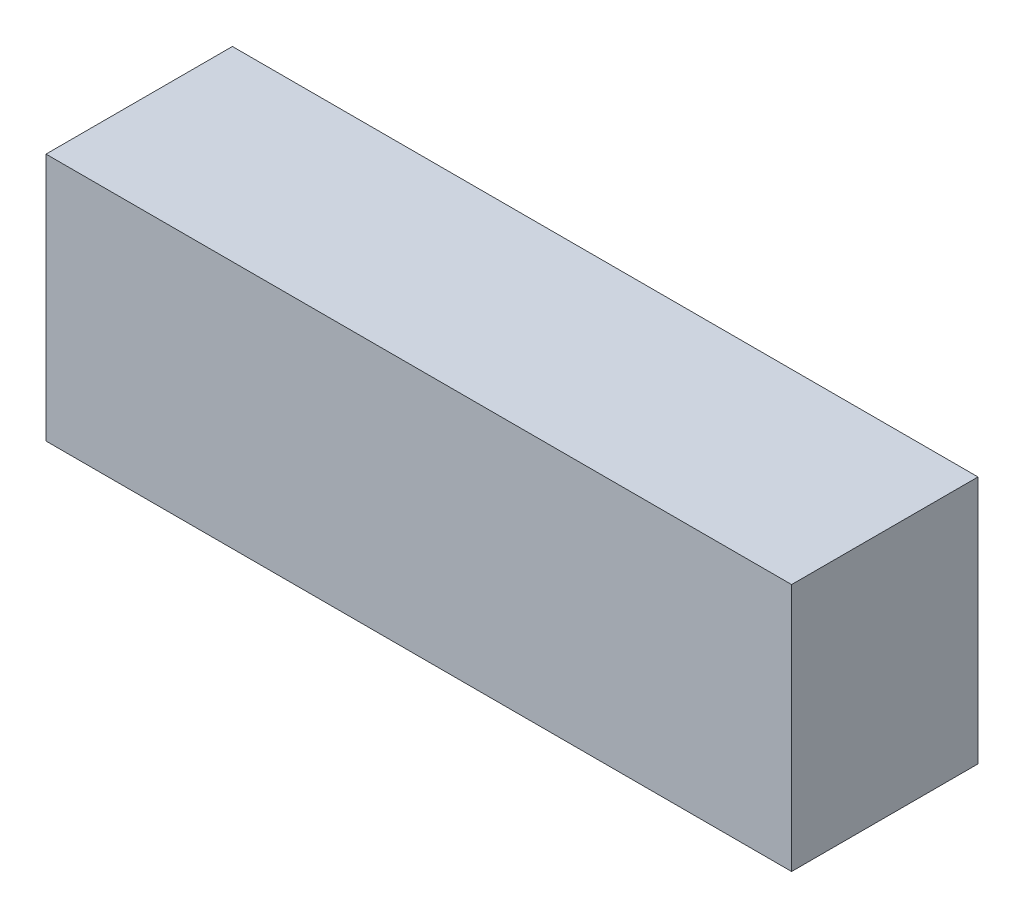
ISO-10303-21;
HEADER;
FILE_DESCRIPTION(('STEP AP214'),'2;1');
FILE_NAME('part.step','',(''),(''),'','','');
FILE_SCHEMA(('AUTOMOTIVE_DESIGN { 1 0 10303 214 1 1 1 1 }'));
ENDSEC;
DATA;
#1=APPLICATION_CONTEXT('core data for automotive mechanical design processes');
#2=APPLICATION_PROTOCOL_DEFINITION('international standard','automotive_design',2000,#1);
#3=PRODUCT_CONTEXT('',#1,'mechanical');
#4=PRODUCT('Part','Part','',(#3));
#5=PRODUCT_RELATED_PRODUCT_CATEGORY('part','',(#4));
#6=PRODUCT_DEFINITION_FORMATION('','',#4);
#7=PRODUCT_DEFINITION_CONTEXT('part definition',#1,'design');
#8=PRODUCT_DEFINITION('design','',#6,#7);
#9=PRODUCT_DEFINITION_SHAPE('','',#8);
#10=(LENGTH_UNIT() NAMED_UNIT(*) SI_UNIT(.MILLI.,.METRE.));
#11=(NAMED_UNIT(*) PLANE_ANGLE_UNIT() SI_UNIT($,.RADIAN.));
#12=(NAMED_UNIT(*) SI_UNIT($,.STERADIAN.) SOLID_ANGLE_UNIT());
#13=UNCERTAINTY_MEASURE_WITH_UNIT(LENGTH_MEASURE(1.E-05),#10,'distance_accuracy_value','');
#14=(GEOMETRIC_REPRESENTATION_CONTEXT(3) GLOBAL_UNCERTAINTY_ASSIGNED_CONTEXT((#13)) GLOBAL_UNIT_ASSIGNED_CONTEXT((#10,
#11,#12)) REPRESENTATION_CONTEXT('',''));
#15=CARTESIAN_POINT('',(0.,0.,0.));
#16=DIRECTION('',(0.,0.,1.));
#17=DIRECTION('',(1.,0.,0.));
#18=AXIS2_PLACEMENT_3D('',#15,#16,#17);
#19=CARTESIAN_POINT('',(275.,-45.,37.8606367334853));
#20=DIRECTION('',(-1.,0.,0.));
#21=DIRECTION('',(0.,0.,1.));
#22=AXIS2_PLACEMENT_3D('',#19,#20,#21);
#23=PLANE('',#22);
#24=DIRECTION('',(0.,1.,0.));
#25=VECTOR('',#24,1.);
#26=CARTESIAN_POINT('',(275.,-45.,7.86063673348532));
#27=LINE('',#26,#25);
#28=CARTESIAN_POINT('',(275.,-45.,7.86063673348532));
#29=VERTEX_POINT('',#28);
#30=CARTESIAN_POINT('',(275.,-5.00000000000002,7.86063673348532));
#31=VERTEX_POINT('',#30);
#32=EDGE_CURVE('E103',#29,#31,#27,.T.);
#33=ORIENTED_EDGE('',*,*,#32,.T.);
#34=DIRECTION('',(0.,0.,-1.));
#35=VECTOR('',#34,1.);
#36=CARTESIAN_POINT('',(275.,-5.00000000000002,37.8606367334853));
#37=LINE('',#36,#35);
#38=CARTESIAN_POINT('',(275.,-5.00000000000002,37.8606367334853));
#39=VERTEX_POINT('',#38);
#40=EDGE_CURVE('E11',#39,#31,#37,.T.);
#41=ORIENTED_EDGE('',*,*,#40,.F.);
#42=DIRECTION('',(0.,1.,0.));
#43=VECTOR('',#42,1.);
#44=CARTESIAN_POINT('',(275.,-45.,37.8606367334853));
#45=LINE('',#44,#43);
#46=CARTESIAN_POINT('',(275.,-45.,37.8606367334853));
#47=VERTEX_POINT('',#46);
#48=EDGE_CURVE('E91',#47,#39,#45,.T.);
#49=ORIENTED_EDGE('',*,*,#48,.F.);
#50=DIRECTION('',(0.,0.,-1.));
#51=VECTOR('',#50,1.);
#52=CARTESIAN_POINT('',(275.,-45.,37.8606367334853));
#53=LINE('',#52,#51);
#54=EDGE_CURVE('E99',#47,#29,#53,.T.);
#55=ORIENTED_EDGE('',*,*,#54,.T.);
#56=EDGE_LOOP('',(#33,#41,#49,#55));
#57=FACE_BOUND('',#56,.T.);
#58=ADVANCED_FACE('F40',(#57),#23,.F.);
#59=CARTESIAN_POINT('',(275.,-5.00000000000002,37.8606367334853));
#60=DIRECTION('',(0.,-1.,0.));
#61=DIRECTION('',(1.,0.,0.));
#62=AXIS2_PLACEMENT_3D('',#59,#60,#61);
#63=PLANE('',#62);
#64=DIRECTION('',(-1.,0.,0.));
#65=VECTOR('',#64,1.);
#66=CARTESIAN_POINT('',(275.,-5.00000000000002,7.86063673348532));
#67=LINE('',#66,#65);
#68=CARTESIAN_POINT('',(155.,-5.00000000000004,7.86063673348532));
#69=VERTEX_POINT('',#68);
#70=EDGE_CURVE('E95',#31,#69,#67,.T.);
#71=ORIENTED_EDGE('',*,*,#70,.T.);
#72=DIRECTION('',(0.,0.,-1.));
#73=VECTOR('',#72,1.);
#74=CARTESIAN_POINT('',(155.,-5.00000000000004,37.8606367334853));
#75=LINE('',#74,#73);
#76=CARTESIAN_POINT('',(155.,-5.00000000000004,37.8606367334853));
#77=VERTEX_POINT('',#76);
#78=EDGE_CURVE('E48',#77,#69,#75,.T.);
#79=ORIENTED_EDGE('',*,*,#78,.F.);
#80=DIRECTION('',(-1.,0.,0.));
#81=VECTOR('',#80,1.);
#82=CARTESIAN_POINT('',(275.,-5.00000000000002,37.8606367334853));
#83=LINE('',#82,#81);
#84=EDGE_CURVE('E86',#39,#77,#83,.T.);
#85=ORIENTED_EDGE('',*,*,#84,.F.);
#86=ORIENTED_EDGE('',*,*,#40,.T.);
#87=EDGE_LOOP('',(#71,#79,#85,#86));
#88=FACE_BOUND('',#87,.T.);
#89=ADVANCED_FACE('F94',(#88),#63,.F.);
#90=CARTESIAN_POINT('',(155.,-45.,37.8606367334853));
#91=DIRECTION('',(1.,0.,0.));
#92=DIRECTION('',(0.,0.,-1.));
#93=AXIS2_PLACEMENT_3D('',#90,#91,#92);
#94=PLANE('',#93);
#95=DIRECTION('',(0.,-1.,0.));
#96=VECTOR('',#95,1.);
#97=CARTESIAN_POINT('',(155.,-45.,7.86063673348532));
#98=LINE('',#97,#96);
#99=CARTESIAN_POINT('',(155.,-45.,7.86063673348532));
#100=VERTEX_POINT('',#99);
#101=EDGE_CURVE('E73',#69,#100,#98,.T.);
#102=ORIENTED_EDGE('',*,*,#101,.T.);
#103=DIRECTION('',(0.,0.,-1.));
#104=VECTOR('',#103,1.);
#105=CARTESIAN_POINT('',(155.,-45.,37.8606367334853));
#106=LINE('',#105,#104);
#107=CARTESIAN_POINT('',(155.,-45.,37.8606367334853));
#108=VERTEX_POINT('',#107);
#109=EDGE_CURVE('E96',#108,#100,#106,.T.);
#110=ORIENTED_EDGE('',*,*,#109,.F.);
#111=DIRECTION('',(0.,-1.,0.));
#112=VECTOR('',#111,1.);
#113=CARTESIAN_POINT('',(155.,-45.,37.8606367334853));
#114=LINE('',#113,#112);
#115=EDGE_CURVE('E89',#77,#108,#114,.T.);
#116=ORIENTED_EDGE('',*,*,#115,.F.);
#117=ORIENTED_EDGE('',*,*,#78,.T.);
#118=EDGE_LOOP('',(#102,#110,#116,#117));
#119=FACE_BOUND('',#118,.T.);
#120=ADVANCED_FACE('F97',(#119),#94,.F.);
#121=CARTESIAN_POINT('',(275.,-45.,37.8606367334853));
#122=DIRECTION('',(0.,1.,0.));
#123=DIRECTION('',(-1.,0.,0.));
#124=AXIS2_PLACEMENT_3D('',#121,#122,#123);
#125=PLANE('',#124);
#126=DIRECTION('',(1.,0.,0.));
#127=VECTOR('',#126,1.);
#128=CARTESIAN_POINT('',(275.,-45.,7.86063673348532));
#129=LINE('',#128,#127);
#130=EDGE_CURVE('E79',#100,#29,#129,.T.);
#131=ORIENTED_EDGE('',*,*,#130,.T.);
#132=ORIENTED_EDGE('',*,*,#54,.F.);
#133=DIRECTION('',(1.,0.,0.));
#134=VECTOR('',#133,1.);
#135=CARTESIAN_POINT('',(275.,-45.,37.8606367334853));
#136=LINE('',#135,#134);
#137=EDGE_CURVE('E56',#108,#47,#136,.T.);
#138=ORIENTED_EDGE('',*,*,#137,.F.);
#139=ORIENTED_EDGE('',*,*,#109,.T.);
#140=EDGE_LOOP('',(#131,#132,#138,#139));
#141=FACE_BOUND('',#140,.T.);
#142=ADVANCED_FACE('F110',(#141),#125,.F.);
#143=CARTESIAN_POINT('',(0.,0.,37.8606367334853));
#144=DIRECTION('',(0.,0.,1.));
#145=DIRECTION('',(1.,0.,0.));
#146=AXIS2_PLACEMENT_3D('',#143,#144,#145);
#147=PLANE('',#146);
#148=ORIENTED_EDGE('',*,*,#48,.T.);
#149=ORIENTED_EDGE('',*,*,#84,.T.);
#150=ORIENTED_EDGE('',*,*,#115,.T.);
#151=ORIENTED_EDGE('',*,*,#137,.T.);
#152=EDGE_LOOP('',(#148,#149,#150,#151));
#153=FACE_BOUND('',#152,.T.);
#154=ADVANCED_FACE('F87',(#153),#147,.T.);
#155=CARTESIAN_POINT('',(0.,0.,7.86063673348532));
#156=DIRECTION('',(0.,0.,1.));
#157=DIRECTION('',(1.,0.,0.));
#158=AXIS2_PLACEMENT_3D('',#155,#156,#157);
#159=PLANE('',#158);
#160=ORIENTED_EDGE('',*,*,#32,.F.);
#161=ORIENTED_EDGE('',*,*,#130,.F.);
#162=ORIENTED_EDGE('',*,*,#101,.F.);
#163=ORIENTED_EDGE('',*,*,#70,.F.);
#164=EDGE_LOOP('',(#160,#161,#162,#163));
#165=FACE_BOUND('',#164,.T.);
#166=ADVANCED_FACE('F113',(#165),#159,.F.);
#167=CLOSED_SHELL('',(#58,#89,#120,#142,#154,#166));
#168=MANIFOLD_SOLID_BREP('B2',#167);
#169=ADVANCED_BREP_SHAPE_REPRESENTATION('',(#18,#168),#14);
#170=SHAPE_DEFINITION_REPRESENTATION(#9,#169);
ENDSEC;
END-ISO-10303-21;
